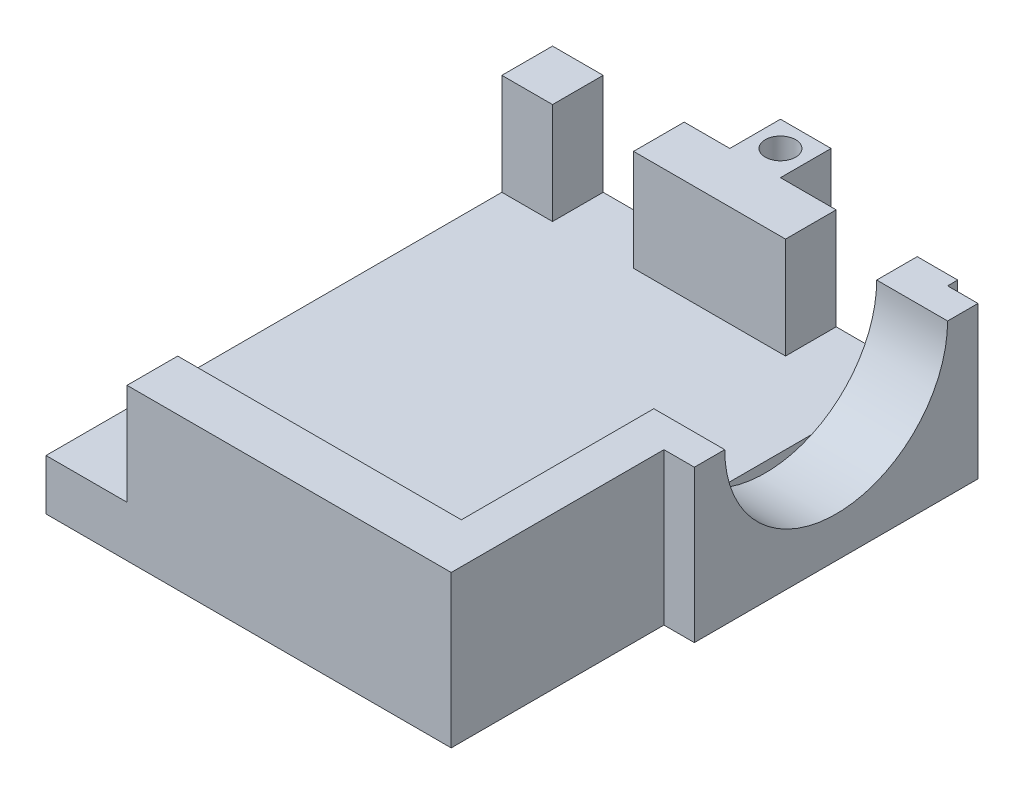
ISO-10303-21;
HEADER;
FILE_DESCRIPTION(('STEP AP214'),'2;1');
FILE_NAME('part.step','',(''),(''),'','','');
FILE_SCHEMA(('AUTOMOTIVE_DESIGN { 1 0 10303 214 1 1 1 1 }'));
ENDSEC;
DATA;
#1=APPLICATION_CONTEXT('core data for automotive mechanical design processes');
#2=APPLICATION_PROTOCOL_DEFINITION('international standard','automotive_design',2000,#1);
#3=PRODUCT_CONTEXT('',#1,'mechanical');
#4=PRODUCT('Part','Part','',(#3));
#5=PRODUCT_RELATED_PRODUCT_CATEGORY('part','',(#4));
#6=PRODUCT_DEFINITION_FORMATION('','',#4);
#7=PRODUCT_DEFINITION_CONTEXT('part definition',#1,'design');
#8=PRODUCT_DEFINITION('design','',#6,#7);
#9=PRODUCT_DEFINITION_SHAPE('','',#8);
#10=(LENGTH_UNIT() NAMED_UNIT(*) SI_UNIT(.MILLI.,.METRE.));
#11=(NAMED_UNIT(*) PLANE_ANGLE_UNIT() SI_UNIT($,.RADIAN.));
#12=(NAMED_UNIT(*) SI_UNIT($,.STERADIAN.) SOLID_ANGLE_UNIT());
#13=UNCERTAINTY_MEASURE_WITH_UNIT(LENGTH_MEASURE(1.E-05),#10,'distance_accuracy_value','');
#14=(GEOMETRIC_REPRESENTATION_CONTEXT(3) GLOBAL_UNCERTAINTY_ASSIGNED_CONTEXT((#13)) GLOBAL_UNIT_ASSIGNED_CONTEXT((#10,
#11,#12)) REPRESENTATION_CONTEXT('',''));
#15=CARTESIAN_POINT('',(0.,0.,0.));
#16=DIRECTION('',(0.,0.,1.));
#17=DIRECTION('',(1.,0.,0.));
#18=AXIS2_PLACEMENT_3D('',#15,#16,#17);
#19=CARTESIAN_POINT('',(-20.,5.,-25.));
#20=DIRECTION('',(0.,0.,1.));
#21=DIRECTION('',(1.,0.,0.));
#22=AXIS2_PLACEMENT_3D('',#19,#20,#21);
#23=PLANE('',#22);
#24=DIRECTION('',(0.,1.,0.));
#25=VECTOR('',#24,1.);
#26=CARTESIAN_POINT('',(-2.5,10.,-25.));
#27=LINE('',#26,#25);
#28=CARTESIAN_POINT('',(-2.5,10.,-25.));
#29=VERTEX_POINT('',#28);
#30=CARTESIAN_POINT('',(-2.5,15.,-25.));
#31=VERTEX_POINT('',#30);
#32=EDGE_CURVE('E116',#29,#31,#27,.T.);
#33=ORIENTED_EDGE('',*,*,#32,.F.);
#34=DIRECTION('',(-1.,0.,0.));
#35=VECTOR('',#34,1.);
#36=CARTESIAN_POINT('',(-2.5,10.,-25.));
#37=LINE('',#36,#35);
#38=CARTESIAN_POINT('',(2.5,10.,-25.));
#39=VERTEX_POINT('',#38);
#40=EDGE_CURVE('E293',#39,#29,#37,.T.);
#41=ORIENTED_EDGE('',*,*,#40,.F.);
#42=DIRECTION('',(0.,-1.,0.));
#43=VECTOR('',#42,1.);
#44=CARTESIAN_POINT('',(2.5,10.,-25.));
#45=LINE('',#44,#43);
#46=CARTESIAN_POINT('',(2.5,15.,-25.));
#47=VERTEX_POINT('',#46);
#48=EDGE_CURVE('E835',#47,#39,#45,.T.);
#49=ORIENTED_EDGE('',*,*,#48,.F.);
#50=DIRECTION('',(-1.,0.,0.));
#51=VECTOR('',#50,1.);
#52=CARTESIAN_POINT('',(0.,15.,-25.));
#53=LINE('',#52,#51);
#54=CARTESIAN_POINT('',(8.,15.,-25.));
#55=VERTEX_POINT('',#54);
#56=EDGE_CURVE('E406',#55,#47,#53,.T.);
#57=ORIENTED_EDGE('',*,*,#56,.F.);
#58=DIRECTION('',(0.,-1.,0.));
#59=VECTOR('',#58,1.);
#60=CARTESIAN_POINT('',(8.,15.,-25.));
#61=LINE('',#60,#59);
#62=CARTESIAN_POINT('',(8.,5.,-25.));
#63=VERTEX_POINT('',#62);
#64=EDGE_CURVE('E360',#55,#63,#61,.T.);
#65=ORIENTED_EDGE('',*,*,#64,.T.);
#66=DIRECTION('',(-1.,0.,0.));
#67=VECTOR('',#66,1.);
#68=CARTESIAN_POINT('',(-20.,5.,-25.));
#69=LINE('',#68,#67);
#70=CARTESIAN_POINT('',(16.,5.,-25.));
#71=VERTEX_POINT('',#70);
#72=EDGE_CURVE('E440',#71,#63,#69,.T.);
#73=ORIENTED_EDGE('',*,*,#72,.F.);
#74=DIRECTION('',(0.,-1.,0.));
#75=VECTOR('',#74,1.);
#76=CARTESIAN_POINT('',(16.,15.,-25.));
#77=LINE('',#76,#75);
#78=CARTESIAN_POINT('',(16.,15.,-25.));
#79=VERTEX_POINT('',#78);
#80=EDGE_CURVE('E346',#79,#71,#77,.T.);
#81=ORIENTED_EDGE('',*,*,#80,.F.);
#82=DIRECTION('',(-1.,0.,0.));
#83=VECTOR('',#82,1.);
#84=CARTESIAN_POINT('',(0.,15.,-25.));
#85=LINE('',#84,#83);
#86=CARTESIAN_POINT('',(20.,15.,-25.));
#87=VERTEX_POINT('',#86);
#88=EDGE_CURVE('E377',#87,#79,#85,.T.);
#89=ORIENTED_EDGE('',*,*,#88,.F.);
#90=DIRECTION('',(0.,-1.,0.));
#91=VECTOR('',#90,1.);
#92=CARTESIAN_POINT('',(20.,5.,-25.));
#93=LINE('',#92,#91);
#94=CARTESIAN_POINT('',(20.,0.,-25.));
#95=VERTEX_POINT('',#94);
#96=EDGE_CURVE('E453',#87,#95,#93,.T.);
#97=ORIENTED_EDGE('',*,*,#96,.T.);
#98=DIRECTION('',(-1.,0.,0.));
#99=VECTOR('',#98,1.);
#100=CARTESIAN_POINT('',(-20.,0.,-25.));
#101=LINE('',#100,#99);
#102=CARTESIAN_POINT('',(-20.,0.,-25.));
#103=VERTEX_POINT('',#102);
#104=EDGE_CURVE('E436',#95,#103,#101,.T.);
#105=ORIENTED_EDGE('',*,*,#104,.T.);
#106=DIRECTION('',(0.,-1.,0.));
#107=VECTOR('',#106,1.);
#108=CARTESIAN_POINT('',(-20.,5.,-25.));
#109=LINE('',#108,#107);
#110=CARTESIAN_POINT('',(-20.,15.,-25.));
#111=VERTEX_POINT('',#110);
#112=EDGE_CURVE('E442',#111,#103,#109,.T.);
#113=ORIENTED_EDGE('',*,*,#112,.F.);
#114=DIRECTION('',(1.,0.,0.));
#115=VECTOR('',#114,1.);
#116=CARTESIAN_POINT('',(-20.,15.,-25.));
#117=LINE('',#116,#115);
#118=CARTESIAN_POINT('',(-15.,15.,-25.));
#119=VERTEX_POINT('',#118);
#120=EDGE_CURVE('E416',#111,#119,#117,.T.);
#121=ORIENTED_EDGE('',*,*,#120,.T.);
#122=DIRECTION('',(0.,-1.,0.));
#123=VECTOR('',#122,1.);
#124=CARTESIAN_POINT('',(-15.,15.,-25.));
#125=LINE('',#124,#123);
#126=CARTESIAN_POINT('',(-15.,5.,-25.));
#127=VERTEX_POINT('',#126);
#128=EDGE_CURVE('E426',#119,#127,#125,.T.);
#129=ORIENTED_EDGE('',*,*,#128,.T.);
#130=CARTESIAN_POINT('',(-7.,5.,-25.));
#131=VERTEX_POINT('',#130);
#132=EDGE_CURVE('E439',#131,#127,#69,.T.);
#133=ORIENTED_EDGE('',*,*,#132,.F.);
#134=DIRECTION('',(0.,-1.,0.));
#135=VECTOR('',#134,1.);
#136=CARTESIAN_POINT('',(-7.,15.,-25.));
#137=LINE('',#136,#135);
#138=CARTESIAN_POINT('',(-7.,15.,-25.));
#139=VERTEX_POINT('',#138);
#140=EDGE_CURVE('E385',#139,#131,#137,.T.);
#141=ORIENTED_EDGE('',*,*,#140,.F.);
#142=EDGE_CURVE('E121',#31,#139,#53,.T.);
#143=ORIENTED_EDGE('',*,*,#142,.F.);
#144=EDGE_LOOP('',(#33,#41,#49,#57,#65,#73,#81,#89,#97,#105,#113,#121,#129,#133,#141,#143));
#145=FACE_BOUND('',#144,.T.);
#146=ADVANCED_FACE('F101',(#145),#23,.F.);
#147=CARTESIAN_POINT('',(20.,5.,-25.));
#148=DIRECTION('',(-1.,0.,0.));
#149=DIRECTION('',(0.,0.,1.));
#150=AXIS2_PLACEMENT_3D('',#147,#148,#149);
#151=PLANE('',#150);
#152=DIRECTION('',(0.,-1.,0.));
#153=VECTOR('',#152,1.);
#154=CARTESIAN_POINT('',(20.,15.,4.00000000000002));
#155=LINE('',#154,#153);
#156=CARTESIAN_POINT('',(20.,15.,4.00000000000002));
#157=VERTEX_POINT('',#156);
#158=CARTESIAN_POINT('',(20.,0.,4.00000000000002));
#159=VERTEX_POINT('',#158);
#160=EDGE_CURVE('E299',#157,#159,#155,.T.);
#161=ORIENTED_EDGE('',*,*,#160,.F.);
#162=DIRECTION('',(0.,0.,-1.));
#163=VECTOR('',#162,1.);
#164=CARTESIAN_POINT('',(20.,15.,0.));
#165=LINE('',#164,#163);
#166=CARTESIAN_POINT('',(20.,15.,25.));
#167=VERTEX_POINT('',#166);
#168=EDGE_CURVE('E380',#167,#157,#165,.T.);
#169=ORIENTED_EDGE('',*,*,#168,.F.);
#170=DIRECTION('',(0.,-1.,0.));
#171=VECTOR('',#170,1.);
#172=CARTESIAN_POINT('',(20.,5.,25.));
#173=LINE('',#172,#171);
#174=CARTESIAN_POINT('',(20.,0.,25.));
#175=VERTEX_POINT('',#174);
#176=EDGE_CURVE('E109',#167,#175,#173,.T.);
#177=ORIENTED_EDGE('',*,*,#176,.T.);
#178=DIRECTION('',(0.,0.,-1.));
#179=VECTOR('',#178,1.);
#180=CARTESIAN_POINT('',(20.,0.,-25.));
#181=LINE('',#180,#179);
#182=EDGE_CURVE('E448',#175,#159,#181,.T.);
#183=ORIENTED_EDGE('',*,*,#182,.T.);
#184=EDGE_LOOP('',(#161,#169,#177,#183));
#185=FACE_BOUND('',#184,.T.);
#186=ADVANCED_FACE('F459',(#185),#151,.F.);
#187=DIRECTION('',(0.,1.,0.));
#188=VECTOR('',#187,1.);
#189=CARTESIAN_POINT('',(20.,0.,-24.));
#190=LINE('',#189,#188);
#191=CARTESIAN_POINT('',(20.,0.,-24.));
#192=VERTEX_POINT('',#191);
#193=CARTESIAN_POINT('',(20.,15.,-24.));
#194=VERTEX_POINT('',#193);
#195=EDGE_CURVE('E296',#192,#194,#190,.T.);
#196=ORIENTED_EDGE('',*,*,#195,.F.);
#197=EDGE_CURVE('E447',#192,#95,#181,.T.);
#198=ORIENTED_EDGE('',*,*,#197,.T.);
#199=ORIENTED_EDGE('',*,*,#96,.F.);
#200=EDGE_CURVE('E379',#194,#87,#165,.T.);
#201=ORIENTED_EDGE('',*,*,#200,.F.);
#202=EDGE_LOOP('',(#196,#198,#199,#201));
#203=FACE_BOUND('',#202,.T.);
#204=ADVANCED_FACE('F500',(#203),#151,.F.);
#205=CARTESIAN_POINT('',(16.,15.,0.));
#206=DIRECTION('',(1.,0.,0.));
#207=DIRECTION('',(0.,0.,-1.));
#208=AXIS2_PLACEMENT_3D('',#205,#206,#207);
#209=PLANE('',#208);
#210=DIRECTION('',(0.,0.,1.));
#211=VECTOR('',#210,1.);
#212=CARTESIAN_POINT('',(16.,15.,0.));
#213=LINE('',#212,#211);
#214=CARTESIAN_POINT('',(16.,15.,1.00000000000002));
#215=VERTEX_POINT('',#214);
#216=CARTESIAN_POINT('',(16.,15.,20.));
#217=VERTEX_POINT('',#216);
#218=EDGE_CURVE('E370',#215,#217,#213,.T.);
#219=ORIENTED_EDGE('',*,*,#218,.F.);
#220=CARTESIAN_POINT('',(16.,15.,-9.99999999999998));
#221=DIRECTION('',(1.,0.,0.));
#222=DIRECTION('',(0.,0.,-1.));
#223=AXIS2_PLACEMENT_3D('',#220,#221,#222);
#224=CIRCLE('',#223,11.);
#225=CARTESIAN_POINT('',(16.,5.,-5.41742430504414));
#226=VERTEX_POINT('',#225);
#227=EDGE_CURVE('E335',#215,#226,#224,.T.);
#228=ORIENTED_EDGE('',*,*,#227,.T.);
#229=DIRECTION('',(0.,0.,1.));
#230=VECTOR('',#229,1.);
#231=CARTESIAN_POINT('',(16.,5.,0.));
#232=LINE('',#231,#230);
#233=CARTESIAN_POINT('',(16.,5.,20.));
#234=VERTEX_POINT('',#233);
#235=EDGE_CURVE('E373',#226,#234,#232,.T.);
#236=ORIENTED_EDGE('',*,*,#235,.T.);
#237=DIRECTION('',(0.,-1.,0.));
#238=VECTOR('',#237,1.);
#239=CARTESIAN_POINT('',(16.,15.,20.));
#240=LINE('',#239,#238);
#241=EDGE_CURVE('E367',#217,#234,#240,.T.);
#242=ORIENTED_EDGE('',*,*,#241,.F.);
#243=EDGE_LOOP('',(#219,#228,#236,#242));
#244=FACE_BOUND('',#243,.T.);
#245=ADVANCED_FACE('F518',(#244),#209,.F.);
#246=CARTESIAN_POINT('',(0.,15.,0.));
#247=DIRECTION('',(0.,1.,0.));
#248=DIRECTION('',(0.,0.,1.));
#249=AXIS2_PLACEMENT_3D('',#246,#247,#248);
#250=PLANE('',#249);
#251=DIRECTION('',(1.,0.,0.));
#252=VECTOR('',#251,1.);
#253=CARTESIAN_POINT('',(16.,15.,1.00000000000002));
#254=LINE('',#253,#252);
#255=CARTESIAN_POINT('',(23.,15.,1.00000000000003));
#256=VERTEX_POINT('',#255);
#257=EDGE_CURVE('E340',#215,#256,#254,.T.);
#258=ORIENTED_EDGE('',*,*,#257,.F.);
#259=ORIENTED_EDGE('',*,*,#218,.T.);
#260=DIRECTION('',(-1.,0.,0.));
#261=VECTOR('',#260,1.);
#262=CARTESIAN_POINT('',(-6.99999999999999,15.,20.));
#263=LINE('',#262,#261);
#264=CARTESIAN_POINT('',(-12.,15.,20.));
#265=VERTEX_POINT('',#264);
#266=EDGE_CURVE('E349',#217,#265,#263,.T.);
#267=ORIENTED_EDGE('',*,*,#266,.T.);
#268=DIRECTION('',(0.,0.,1.));
#269=VECTOR('',#268,1.);
#270=CARTESIAN_POINT('',(-12.,15.,20.));
#271=LINE('',#270,#269);
#272=CARTESIAN_POINT('',(-12.,15.,25.));
#273=VERTEX_POINT('',#272);
#274=EDGE_CURVE('E362',#265,#273,#271,.T.);
#275=ORIENTED_EDGE('',*,*,#274,.T.);
#276=DIRECTION('',(-1.,0.,0.));
#277=VECTOR('',#276,1.);
#278=CARTESIAN_POINT('',(-6.99999999999999,15.,25.));
#279=LINE('',#278,#277);
#280=EDGE_CURVE('E357',#167,#273,#279,.T.);
#281=ORIENTED_EDGE('',*,*,#280,.F.);
#282=ORIENTED_EDGE('',*,*,#168,.T.);
#283=DIRECTION('',(-1.,0.,0.));
#284=VECTOR('',#283,1.);
#285=CARTESIAN_POINT('',(23.,15.,4.00000000000002));
#286=LINE('',#285,#284);
#287=CARTESIAN_POINT('',(23.,15.,4.00000000000002));
#288=VERTEX_POINT('',#287);
#289=EDGE_CURVE('E325',#288,#157,#286,.T.);
#290=ORIENTED_EDGE('',*,*,#289,.F.);
#291=DIRECTION('',(0.,0.,1.));
#292=VECTOR('',#291,1.);
#293=CARTESIAN_POINT('',(23.,15.,1.00000000000003));
#294=LINE('',#293,#292);
#295=EDGE_CURVE('E316',#256,#288,#294,.T.);
#296=ORIENTED_EDGE('',*,*,#295,.F.);
#297=EDGE_LOOP('',(#258,#259,#267,#275,#281,#282,#290,#296));
#298=FACE_BOUND('',#297,.T.);
#299=ADVANCED_FACE('F474',(#298),#250,.T.);
#300=CARTESIAN_POINT('',(0.,5.,0.));
#301=DIRECTION('',(0.,1.,0.));
#302=DIRECTION('',(0.,0.,1.));
#303=AXIS2_PLACEMENT_3D('',#300,#301,#302);
#304=PLANE('',#303);
#305=DIRECTION('',(-1.,0.,0.));
#306=VECTOR('',#305,1.);
#307=CARTESIAN_POINT('',(-6.99999999999999,5.,20.));
#308=LINE('',#307,#306);
#309=CARTESIAN_POINT('',(-12.,5.,20.));
#310=VERTEX_POINT('',#309);
#311=EDGE_CURVE('E353',#234,#310,#308,.T.);
#312=ORIENTED_EDGE('',*,*,#311,.F.);
#313=ORIENTED_EDGE('',*,*,#235,.F.);
#314=DIRECTION('',(0.,0.,-1.));
#315=VECTOR('',#314,1.);
#316=CARTESIAN_POINT('',(16.,5.,0.));
#317=LINE('',#316,#315);
#318=CARTESIAN_POINT('',(16.,5.,-14.5825756949558));
#319=VERTEX_POINT('',#318);
#320=EDGE_CURVE('E342',#226,#319,#317,.T.);
#321=ORIENTED_EDGE('',*,*,#320,.T.);
#322=EDGE_CURVE('E352',#71,#319,#232,.T.);
#323=ORIENTED_EDGE('',*,*,#322,.F.);
#324=ORIENTED_EDGE('',*,*,#72,.T.);
#325=DIRECTION('',(0.,0.,1.));
#326=VECTOR('',#325,1.);
#327=CARTESIAN_POINT('',(8.,5.,0.));
#328=LINE('',#327,#326);
#329=CARTESIAN_POINT('',(8.,5.,-20.));
#330=VERTEX_POINT('',#329);
#331=EDGE_CURVE('E399',#63,#330,#328,.T.);
#332=ORIENTED_EDGE('',*,*,#331,.T.);
#333=DIRECTION('',(1.,0.,0.));
#334=VECTOR('',#333,1.);
#335=CARTESIAN_POINT('',(0.,5.,-20.));
#336=LINE('',#335,#334);
#337=CARTESIAN_POINT('',(-7.,5.,-20.));
#338=VERTEX_POINT('',#337);
#339=EDGE_CURVE('E392',#338,#330,#336,.T.);
#340=ORIENTED_EDGE('',*,*,#339,.F.);
#341=DIRECTION('',(0.,0.,1.));
#342=VECTOR('',#341,1.);
#343=CARTESIAN_POINT('',(-6.99999999999999,5.,0.));
#344=LINE('',#343,#342);
#345=EDGE_CURVE('E395',#131,#338,#344,.T.);
#346=ORIENTED_EDGE('',*,*,#345,.F.);
#347=ORIENTED_EDGE('',*,*,#132,.T.);
#348=DIRECTION('',(0.,0.,1.));
#349=VECTOR('',#348,1.);
#350=CARTESIAN_POINT('',(-15.,5.,-25.));
#351=LINE('',#350,#349);
#352=CARTESIAN_POINT('',(-15.,5.,-20.));
#353=VERTEX_POINT('',#352);
#354=EDGE_CURVE('E413',#127,#353,#351,.T.);
#355=ORIENTED_EDGE('',*,*,#354,.T.);
#356=DIRECTION('',(1.,0.,0.));
#357=VECTOR('',#356,1.);
#358=CARTESIAN_POINT('',(-20.,5.,-20.));
#359=LINE('',#358,#357);
#360=CARTESIAN_POINT('',(-20.,5.,-20.));
#361=VERTEX_POINT('',#360);
#362=EDGE_CURVE('E402',#361,#353,#359,.T.);
#363=ORIENTED_EDGE('',*,*,#362,.F.);
#364=DIRECTION('',(0.,0.,1.));
#365=VECTOR('',#364,1.);
#366=CARTESIAN_POINT('',(-20.,5.,-25.));
#367=LINE('',#366,#365);
#368=CARTESIAN_POINT('',(-20.,5.,25.));
#369=VERTEX_POINT('',#368);
#370=EDGE_CURVE('E433',#361,#369,#367,.T.);
#371=ORIENTED_EDGE('',*,*,#370,.T.);
#372=DIRECTION('',(1.,0.,0.));
#373=VECTOR('',#372,1.);
#374=CARTESIAN_POINT('',(-20.,5.,25.));
#375=LINE('',#374,#373);
#376=CARTESIAN_POINT('',(-12.,5.,25.));
#377=VERTEX_POINT('',#376);
#378=EDGE_CURVE('E435',#369,#377,#375,.T.);
#379=ORIENTED_EDGE('',*,*,#378,.T.);
#380=DIRECTION('',(0.,0.,1.));
#381=VECTOR('',#380,1.);
#382=CARTESIAN_POINT('',(-12.,5.,20.));
#383=LINE('',#382,#381);
#384=EDGE_CURVE('E356',#310,#377,#383,.T.);
#385=ORIENTED_EDGE('',*,*,#384,.F.);
#386=EDGE_LOOP('',(#312,#313,#321,#323,#324,#332,#340,#346,#347,#355,#363,#371,#379,#385));
#387=FACE_BOUND('',#386,.T.);
#388=ADVANCED_FACE('F487',(#387),#304,.T.);
#389=CARTESIAN_POINT('',(-20.,5.,-25.));
#390=DIRECTION('',(1.,0.,0.));
#391=DIRECTION('',(0.,0.,-1.));
#392=AXIS2_PLACEMENT_3D('',#389,#390,#391);
#393=PLANE('',#392);
#394=DIRECTION('',(0.,0.,1.));
#395=VECTOR('',#394,1.);
#396=CARTESIAN_POINT('',(-20.,0.,-25.));
#397=LINE('',#396,#395);
#398=CARTESIAN_POINT('',(-20.,0.,25.));
#399=VERTEX_POINT('',#398);
#400=EDGE_CURVE('E432',#103,#399,#397,.T.);
#401=ORIENTED_EDGE('',*,*,#400,.T.);
#402=DIRECTION('',(0.,-1.,0.));
#403=VECTOR('',#402,1.);
#404=CARTESIAN_POINT('',(-20.,5.,25.));
#405=LINE('',#404,#403);
#406=EDGE_CURVE('E12',#369,#399,#405,.T.);
#407=ORIENTED_EDGE('',*,*,#406,.F.);
#408=ORIENTED_EDGE('',*,*,#370,.F.);
#409=DIRECTION('',(0.,-1.,0.));
#410=VECTOR('',#409,1.);
#411=CARTESIAN_POINT('',(-20.,15.,-20.));
#412=LINE('',#411,#410);
#413=CARTESIAN_POINT('',(-20.,15.,-20.));
#414=VERTEX_POINT('',#413);
#415=EDGE_CURVE('E421',#414,#361,#412,.T.);
#416=ORIENTED_EDGE('',*,*,#415,.F.);
#417=DIRECTION('',(0.,0.,1.));
#418=VECTOR('',#417,1.);
#419=CARTESIAN_POINT('',(-20.,15.,-25.));
#420=LINE('',#419,#418);
#421=EDGE_CURVE('E419',#111,#414,#420,.T.);
#422=ORIENTED_EDGE('',*,*,#421,.F.);
#423=ORIENTED_EDGE('',*,*,#112,.T.);
#424=EDGE_LOOP('',(#401,#407,#408,#416,#422,#423));
#425=FACE_BOUND('',#424,.T.);
#426=ADVANCED_FACE('F103',(#425),#393,.F.);
#427=CARTESIAN_POINT('',(-20.,5.,25.));
#428=DIRECTION('',(0.,0.,-1.));
#429=DIRECTION('',(-1.,0.,0.));
#430=AXIS2_PLACEMENT_3D('',#427,#428,#429);
#431=PLANE('',#430);
#432=DIRECTION('',(1.,0.,0.));
#433=VECTOR('',#432,1.);
#434=CARTESIAN_POINT('',(-20.,0.,25.));
#435=LINE('',#434,#433);
#436=EDGE_CURVE('E445',#399,#175,#435,.T.);
#437=ORIENTED_EDGE('',*,*,#436,.T.);
#438=ORIENTED_EDGE('',*,*,#176,.F.);
#439=ORIENTED_EDGE('',*,*,#280,.T.);
#440=DIRECTION('',(0.,-1.,0.));
#441=VECTOR('',#440,1.);
#442=CARTESIAN_POINT('',(-12.,15.,25.));
#443=LINE('',#442,#441);
#444=EDGE_CURVE('E347',#273,#377,#443,.T.);
#445=ORIENTED_EDGE('',*,*,#444,.T.);
#446=ORIENTED_EDGE('',*,*,#378,.F.);
#447=ORIENTED_EDGE('',*,*,#406,.T.);
#448=EDGE_LOOP('',(#437,#438,#439,#445,#446,#447));
#449=FACE_BOUND('',#448,.T.);
#450=ADVANCED_FACE('F478',(#449),#431,.F.);
#451=CARTESIAN_POINT('',(0.,0.,0.));
#452=DIRECTION('',(0.,1.,0.));
#453=DIRECTION('',(0.,0.,1.));
#454=AXIS2_PLACEMENT_3D('',#451,#452,#453);
#455=PLANE('',#454);
#456=ORIENTED_EDGE('',*,*,#400,.F.);
#457=ORIENTED_EDGE('',*,*,#104,.F.);
#458=ORIENTED_EDGE('',*,*,#197,.F.);
#459=DIRECTION('',(-1.,0.,0.));
#460=VECTOR('',#459,1.);
#461=CARTESIAN_POINT('',(23.,0.,-24.));
#462=LINE('',#461,#460);
#463=CARTESIAN_POINT('',(23.,0.,-24.));
#464=VERTEX_POINT('',#463);
#465=EDGE_CURVE('E331',#464,#192,#462,.T.);
#466=ORIENTED_EDGE('',*,*,#465,.F.);
#467=DIRECTION('',(0.,0.,-1.));
#468=VECTOR('',#467,1.);
#469=CARTESIAN_POINT('',(23.,0.,4.00000000000002));
#470=LINE('',#469,#468);
#471=CARTESIAN_POINT('',(23.,0.,4.00000000000002));
#472=VERTEX_POINT('',#471);
#473=EDGE_CURVE('E305',#472,#464,#470,.T.);
#474=ORIENTED_EDGE('',*,*,#473,.F.);
#475=DIRECTION('',(-1.,0.,0.));
#476=VECTOR('',#475,1.);
#477=CARTESIAN_POINT('',(23.,0.,4.00000000000002));
#478=LINE('',#477,#476);
#479=EDGE_CURVE('E319',#472,#159,#478,.T.);
#480=ORIENTED_EDGE('',*,*,#479,.T.);
#481=ORIENTED_EDGE('',*,*,#182,.F.);
#482=ORIENTED_EDGE('',*,*,#436,.F.);
#483=EDGE_LOOP('',(#456,#457,#458,#466,#474,#480,#481,#482));
#484=FACE_BOUND('',#483,.T.);
#485=ADVANCED_FACE('F464',(#484),#455,.F.);
#486=CARTESIAN_POINT('',(-20.,15.,-20.));
#487=DIRECTION('',(0.,0.,-1.));
#488=DIRECTION('',(-1.,0.,0.));
#489=AXIS2_PLACEMENT_3D('',#486,#487,#488);
#490=PLANE('',#489);
#491=ORIENTED_EDGE('',*,*,#362,.T.);
#492=DIRECTION('',(0.,-1.,0.));
#493=VECTOR('',#492,1.);
#494=CARTESIAN_POINT('',(-15.,15.,-20.));
#495=LINE('',#494,#493);
#496=CARTESIAN_POINT('',(-15.,15.,-20.));
#497=VERTEX_POINT('',#496);
#498=EDGE_CURVE('E429',#497,#353,#495,.T.);
#499=ORIENTED_EDGE('',*,*,#498,.F.);
#500=DIRECTION('',(1.,0.,0.));
#501=VECTOR('',#500,1.);
#502=CARTESIAN_POINT('',(-20.,15.,-20.));
#503=LINE('',#502,#501);
#504=EDGE_CURVE('E410',#414,#497,#503,.T.);
#505=ORIENTED_EDGE('',*,*,#504,.F.);
#506=ORIENTED_EDGE('',*,*,#415,.T.);
#507=EDGE_LOOP('',(#491,#499,#505,#506));
#508=FACE_BOUND('',#507,.T.);
#509=ADVANCED_FACE('F551',(#508),#490,.F.);
#510=CARTESIAN_POINT('',(-15.,15.,-25.));
#511=DIRECTION('',(1.,0.,0.));
#512=DIRECTION('',(0.,0.,-1.));
#513=AXIS2_PLACEMENT_3D('',#510,#511,#512);
#514=PLANE('',#513);
#515=ORIENTED_EDGE('',*,*,#354,.F.);
#516=ORIENTED_EDGE('',*,*,#128,.F.);
#517=DIRECTION('',(0.,0.,1.));
#518=VECTOR('',#517,1.);
#519=CARTESIAN_POINT('',(-15.,15.,-25.));
#520=LINE('',#519,#518);
#521=EDGE_CURVE('E412',#119,#497,#520,.T.);
#522=ORIENTED_EDGE('',*,*,#521,.T.);
#523=ORIENTED_EDGE('',*,*,#498,.T.);
#524=EDGE_LOOP('',(#515,#516,#522,#523));
#525=FACE_BOUND('',#524,.T.);
#526=ADVANCED_FACE('F548',(#525),#514,.T.);
#527=CARTESIAN_POINT('',(0.,15.,0.));
#528=DIRECTION('',(0.,-1.,0.));
#529=DIRECTION('',(0.,0.,-1.));
#530=AXIS2_PLACEMENT_3D('',#527,#528,#529);
#531=PLANE('',#530);
#532=ORIENTED_EDGE('',*,*,#504,.T.);
#533=ORIENTED_EDGE('',*,*,#521,.F.);
#534=ORIENTED_EDGE('',*,*,#120,.F.);
#535=ORIENTED_EDGE('',*,*,#421,.T.);
#536=EDGE_LOOP('',(#532,#533,#534,#535));
#537=FACE_BOUND('',#536,.T.);
#538=ADVANCED_FACE('F553',(#537),#531,.F.);
#539=CARTESIAN_POINT('',(8.,15.,0.));
#540=DIRECTION('',(1.,0.,0.));
#541=DIRECTION('',(0.,0.,-1.));
#542=AXIS2_PLACEMENT_3D('',#539,#540,#541);
#543=PLANE('',#542);
#544=ORIENTED_EDGE('',*,*,#331,.F.);
#545=ORIENTED_EDGE('',*,*,#64,.F.);
#546=DIRECTION('',(0.,0.,1.));
#547=VECTOR('',#546,1.);
#548=CARTESIAN_POINT('',(8.,15.,0.));
#549=LINE('',#548,#547);
#550=CARTESIAN_POINT('',(8.,15.,-20.));
#551=VERTEX_POINT('',#550);
#552=EDGE_CURVE('E396',#55,#551,#549,.T.);
#553=ORIENTED_EDGE('',*,*,#552,.T.);
#554=DIRECTION('',(0.,-1.,0.));
#555=VECTOR('',#554,1.);
#556=CARTESIAN_POINT('',(8.,15.,-20.));
#557=LINE('',#556,#555);
#558=EDGE_CURVE('E389',#551,#330,#557,.T.);
#559=ORIENTED_EDGE('',*,*,#558,.T.);
#560=EDGE_LOOP('',(#544,#545,#553,#559));
#561=FACE_BOUND('',#560,.T.);
#562=ADVANCED_FACE('F534',(#561),#543,.T.);
#563=CARTESIAN_POINT('',(-6.99999999999999,15.,0.));
#564=DIRECTION('',(1.,0.,0.));
#565=DIRECTION('',(0.,0.,-1.));
#566=AXIS2_PLACEMENT_3D('',#563,#564,#565);
#567=PLANE('',#566);
#568=ORIENTED_EDGE('',*,*,#345,.T.);
#569=DIRECTION('',(0.,-1.,0.));
#570=VECTOR('',#569,1.);
#571=CARTESIAN_POINT('',(-7.,15.,-20.));
#572=LINE('',#571,#570);
#573=CARTESIAN_POINT('',(-7.,15.,-20.));
#574=VERTEX_POINT('',#573);
#575=EDGE_CURVE('E387',#574,#338,#572,.T.);
#576=ORIENTED_EDGE('',*,*,#575,.F.);
#577=DIRECTION('',(0.,0.,1.));
#578=VECTOR('',#577,1.);
#579=CARTESIAN_POINT('',(-6.99999999999999,15.,0.));
#580=LINE('',#579,#578);
#581=EDGE_CURVE('E404',#139,#574,#580,.T.);
#582=ORIENTED_EDGE('',*,*,#581,.F.);
#583=ORIENTED_EDGE('',*,*,#140,.T.);
#584=EDGE_LOOP('',(#568,#576,#582,#583));
#585=FACE_BOUND('',#584,.T.);
#586=ADVANCED_FACE('F542',(#585),#567,.F.);
#587=CARTESIAN_POINT('',(0.,15.,-20.));
#588=DIRECTION('',(0.,0.,-1.));
#589=DIRECTION('',(-1.,0.,0.));
#590=AXIS2_PLACEMENT_3D('',#587,#588,#589);
#591=PLANE('',#590);
#592=ORIENTED_EDGE('',*,*,#339,.T.);
#593=ORIENTED_EDGE('',*,*,#558,.F.);
#594=DIRECTION('',(1.,0.,0.));
#595=VECTOR('',#594,1.);
#596=CARTESIAN_POINT('',(0.,15.,-20.));
#597=LINE('',#596,#595);
#598=EDGE_CURVE('E391',#574,#551,#597,.T.);
#599=ORIENTED_EDGE('',*,*,#598,.F.);
#600=ORIENTED_EDGE('',*,*,#575,.T.);
#601=EDGE_LOOP('',(#592,#593,#599,#600));
#602=FACE_BOUND('',#601,.T.);
#603=ADVANCED_FACE('F538',(#602),#591,.F.);
#604=CARTESIAN_POINT('',(0.,15.,0.));
#605=DIRECTION('',(0.,1.,0.));
#606=DIRECTION('',(0.,0.,1.));
#607=AXIS2_PLACEMENT_3D('',#604,#605,#606);
#608=PLANE('',#607);
#609=CARTESIAN_POINT('',(0.,15.,-27.5));
#610=DIRECTION('',(0.,-1.,0.));
#611=DIRECTION('',(0.,0.,-1.));
#612=AXIS2_PLACEMENT_3D('',#609,#610,#611);
#613=CIRCLE('',#612,1.5);
#614=CARTESIAN_POINT('',(0.,15.,-29.));
#615=VERTEX_POINT('',#614);
#616=EDGE_CURVE('E824',#615,#615,#613,.T.);
#617=ORIENTED_EDGE('',*,*,#616,.T.);
#618=EDGE_LOOP('',(#617));
#619=FACE_BOUND('',#618,.T.);
#620=ORIENTED_EDGE('',*,*,#552,.F.);
#621=ORIENTED_EDGE('',*,*,#56,.T.);
#622=DIRECTION('',(0.,0.,1.));
#623=VECTOR('',#622,1.);
#624=CARTESIAN_POINT('',(2.5,15.,-30.));
#625=LINE('',#624,#623);
#626=CARTESIAN_POINT('',(2.5,15.,-30.));
#627=VERTEX_POINT('',#626);
#628=EDGE_CURVE('E280',#627,#47,#625,.T.);
#629=ORIENTED_EDGE('',*,*,#628,.F.);
#630=DIRECTION('',(1.,0.,0.));
#631=VECTOR('',#630,1.);
#632=CARTESIAN_POINT('',(-2.5,15.,-30.));
#633=LINE('',#632,#631);
#634=CARTESIAN_POINT('',(-2.5,15.,-30.));
#635=VERTEX_POINT('',#634);
#636=EDGE_CURVE('E272',#635,#627,#633,.T.);
#637=ORIENTED_EDGE('',*,*,#636,.F.);
#638=DIRECTION('',(0.,0.,1.));
#639=VECTOR('',#638,1.);
#640=CARTESIAN_POINT('',(-2.5,15.,-30.));
#641=LINE('',#640,#639);
#642=EDGE_CURVE('E277',#635,#31,#641,.T.);
#643=ORIENTED_EDGE('',*,*,#642,.T.);
#644=ORIENTED_EDGE('',*,*,#142,.T.);
#645=ORIENTED_EDGE('',*,*,#581,.T.);
#646=ORIENTED_EDGE('',*,*,#598,.T.);
#647=EDGE_LOOP('',(#620,#621,#629,#637,#643,#644,#645,#646));
#648=FACE_BOUND('',#647,.T.);
#649=ADVANCED_FACE('F275',(#619,#648),#608,.T.);
#650=ORIENTED_EDGE('',*,*,#322,.T.);
#651=CARTESIAN_POINT('',(16.,15.,-21.));
#652=VERTEX_POINT('',#651);
#653=EDGE_CURVE('E334',#319,#652,#224,.T.);
#654=ORIENTED_EDGE('',*,*,#653,.T.);
#655=EDGE_CURVE('E374',#79,#652,#213,.T.);
#656=ORIENTED_EDGE('',*,*,#655,.F.);
#657=ORIENTED_EDGE('',*,*,#80,.T.);
#658=EDGE_LOOP('',(#650,#654,#656,#657));
#659=FACE_BOUND('',#658,.T.);
#660=ADVANCED_FACE('F527',(#659),#209,.F.);
#661=CARTESIAN_POINT('',(0.,15.,20.));
#662=DIRECTION('',(0.,0.,1.));
#663=DIRECTION('',(1.,0.,0.));
#664=AXIS2_PLACEMENT_3D('',#661,#662,#663);
#665=PLANE('',#664);
#666=ORIENTED_EDGE('',*,*,#241,.T.);
#667=ORIENTED_EDGE('',*,*,#311,.T.);
#668=DIRECTION('',(0.,-1.,0.));
#669=VECTOR('',#668,1.);
#670=CARTESIAN_POINT('',(-12.,15.,20.));
#671=LINE('',#670,#669);
#672=EDGE_CURVE('E350',#265,#310,#671,.T.);
#673=ORIENTED_EDGE('',*,*,#672,.F.);
#674=ORIENTED_EDGE('',*,*,#266,.F.);
#675=EDGE_LOOP('',(#666,#667,#673,#674));
#676=FACE_BOUND('',#675,.T.);
#677=ADVANCED_FACE('F521',(#676),#665,.F.);
#678=DIRECTION('',(1.,0.,0.));
#679=VECTOR('',#678,1.);
#680=CARTESIAN_POINT('',(16.,15.,-21.));
#681=LINE('',#680,#679);
#682=CARTESIAN_POINT('',(23.,15.,-21.));
#683=VERTEX_POINT('',#682);
#684=EDGE_CURVE('E338',#652,#683,#681,.T.);
#685=ORIENTED_EDGE('',*,*,#684,.T.);
#686=DIRECTION('',(0.,0.,1.));
#687=VECTOR('',#686,1.);
#688=CARTESIAN_POINT('',(23.,15.,-24.));
#689=LINE('',#688,#687);
#690=CARTESIAN_POINT('',(23.,15.,-24.));
#691=VERTEX_POINT('',#690);
#692=EDGE_CURVE('E310',#691,#683,#689,.T.);
#693=ORIENTED_EDGE('',*,*,#692,.F.);
#694=DIRECTION('',(-1.,0.,0.));
#695=VECTOR('',#694,1.);
#696=CARTESIAN_POINT('',(23.,15.,-24.));
#697=LINE('',#696,#695);
#698=EDGE_CURVE('E328',#691,#194,#697,.T.);
#699=ORIENTED_EDGE('',*,*,#698,.T.);
#700=ORIENTED_EDGE('',*,*,#200,.T.);
#701=ORIENTED_EDGE('',*,*,#88,.T.);
#702=ORIENTED_EDGE('',*,*,#655,.T.);
#703=EDGE_LOOP('',(#685,#693,#699,#700,#701,#702));
#704=FACE_BOUND('',#703,.T.);
#705=ADVANCED_FACE('F506',(#704),#250,.T.);
#706=CARTESIAN_POINT('',(-12.,15.,20.));
#707=DIRECTION('',(1.,0.,0.));
#708=DIRECTION('',(0.,0.,-1.));
#709=AXIS2_PLACEMENT_3D('',#706,#707,#708);
#710=PLANE('',#709);
#711=ORIENTED_EDGE('',*,*,#384,.T.);
#712=ORIENTED_EDGE('',*,*,#444,.F.);
#713=ORIENTED_EDGE('',*,*,#274,.F.);
#714=ORIENTED_EDGE('',*,*,#672,.T.);
#715=EDGE_LOOP('',(#711,#712,#713,#714));
#716=FACE_BOUND('',#715,.T.);
#717=ADVANCED_FACE('F483',(#716),#710,.F.);
#718=CARTESIAN_POINT('',(16.,15.,-9.99999999999998));
#719=DIRECTION('',(1.,0.,0.));
#720=DIRECTION('',(0.,0.,-1.));
#721=AXIS2_PLACEMENT_3D('',#718,#719,#720);
#722=CYLINDRICAL_SURFACE('',#721,11.);
#723=ORIENTED_EDGE('',*,*,#257,.T.);
#724=CARTESIAN_POINT('',(23.,15.,-9.99999999999998));
#725=DIRECTION('',(-1.,0.,0.));
#726=DIRECTION('',(0.,0.,-1.));
#727=AXIS2_PLACEMENT_3D('',#724,#725,#726);
#728=CIRCLE('',#727,11.);
#729=EDGE_CURVE('E313',#683,#256,#728,.T.);
#730=ORIENTED_EDGE('',*,*,#729,.F.);
#731=ORIENTED_EDGE('',*,*,#684,.F.);
#732=ORIENTED_EDGE('',*,*,#653,.F.);
#733=EDGE_CURVE('E339',#226,#319,#224,.T.);
#734=ORIENTED_EDGE('',*,*,#733,.F.);
#735=ORIENTED_EDGE('',*,*,#227,.F.);
#736=EDGE_LOOP('',(#723,#730,#731,#732,#734,#735));
#737=FACE_BOUND('',#736,.T.);
#738=ADVANCED_FACE('F511',(#737),#722,.F.);
#739=CARTESIAN_POINT('',(16.,15.,-9.99999999999998));
#740=DIRECTION('',(1.,0.,0.));
#741=DIRECTION('',(0.,0.,-1.));
#742=AXIS2_PLACEMENT_3D('',#739,#740,#741);
#743=PLANE('',#742);
#744=ORIENTED_EDGE('',*,*,#733,.T.);
#745=ORIENTED_EDGE('',*,*,#320,.F.);
#746=EDGE_LOOP('',(#744,#745));
#747=FACE_BOUND('',#746,.T.);
#748=ADVANCED_FACE('F679',(#747),#743,.T.);
#749=CARTESIAN_POINT('',(23.,0.,-24.));
#750=DIRECTION('',(0.,0.,1.));
#751=DIRECTION('',(1.,0.,0.));
#752=AXIS2_PLACEMENT_3D('',#749,#750,#751);
#753=PLANE('',#752);
#754=ORIENTED_EDGE('',*,*,#195,.T.);
#755=ORIENTED_EDGE('',*,*,#698,.F.);
#756=DIRECTION('',(0.,1.,0.));
#757=VECTOR('',#756,1.);
#758=CARTESIAN_POINT('',(23.,0.,-24.));
#759=LINE('',#758,#757);
#760=EDGE_CURVE('E308',#464,#691,#759,.T.);
#761=ORIENTED_EDGE('',*,*,#760,.F.);
#762=ORIENTED_EDGE('',*,*,#465,.T.);
#763=EDGE_LOOP('',(#754,#755,#761,#762));
#764=FACE_BOUND('',#763,.T.);
#765=ADVANCED_FACE('F503',(#764),#753,.F.);
#766=CARTESIAN_POINT('',(23.,15.,4.00000000000002));
#767=DIRECTION('',(0.,0.,-1.));
#768=DIRECTION('',(0.,1.,0.));
#769=AXIS2_PLACEMENT_3D('',#766,#767,#768);
#770=PLANE('',#769);
#771=ORIENTED_EDGE('',*,*,#160,.T.);
#772=ORIENTED_EDGE('',*,*,#479,.F.);
#773=DIRECTION('',(0.,-1.,0.));
#774=VECTOR('',#773,1.);
#775=CARTESIAN_POINT('',(23.,15.,4.00000000000002));
#776=LINE('',#775,#774);
#777=EDGE_CURVE('E318',#288,#472,#776,.T.);
#778=ORIENTED_EDGE('',*,*,#777,.F.);
#779=ORIENTED_EDGE('',*,*,#289,.T.);
#780=EDGE_LOOP('',(#771,#772,#778,#779));
#781=FACE_BOUND('',#780,.T.);
#782=ADVANCED_FACE('F470',(#781),#770,.F.);
#783=CARTESIAN_POINT('',(23.,15.,-9.99999999999998));
#784=DIRECTION('',(1.,0.,0.));
#785=DIRECTION('',(0.,0.,-1.));
#786=AXIS2_PLACEMENT_3D('',#783,#784,#785);
#787=PLANE('',#786);
#788=ORIENTED_EDGE('',*,*,#473,.T.);
#789=ORIENTED_EDGE('',*,*,#760,.T.);
#790=ORIENTED_EDGE('',*,*,#692,.T.);
#791=ORIENTED_EDGE('',*,*,#729,.T.);
#792=ORIENTED_EDGE('',*,*,#295,.T.);
#793=ORIENTED_EDGE('',*,*,#777,.T.);
#794=EDGE_LOOP('',(#788,#789,#790,#791,#792,#793));
#795=FACE_BOUND('',#794,.T.);
#796=ADVANCED_FACE('F509',(#795),#787,.T.);
#797=CARTESIAN_POINT('',(-2.5,10.,-30.));
#798=DIRECTION('',(1.,0.,0.));
#799=DIRECTION('',(0.,1.,0.));
#800=AXIS2_PLACEMENT_3D('',#797,#798,#799);
#801=PLANE('',#800);
#802=ORIENTED_EDGE('',*,*,#32,.T.);
#803=ORIENTED_EDGE('',*,*,#642,.F.);
#804=DIRECTION('',(0.,1.,0.));
#805=VECTOR('',#804,1.);
#806=CARTESIAN_POINT('',(-2.5,10.,-30.));
#807=LINE('',#806,#805);
#808=CARTESIAN_POINT('',(-2.5,10.,-30.));
#809=VERTEX_POINT('',#808);
#810=EDGE_CURVE('E284',#809,#635,#807,.T.);
#811=ORIENTED_EDGE('',*,*,#810,.F.);
#812=DIRECTION('',(0.,0.,1.));
#813=VECTOR('',#812,1.);
#814=CARTESIAN_POINT('',(-2.5,10.,-30.));
#815=LINE('',#814,#813);
#816=EDGE_CURVE('E833',#809,#29,#815,.T.);
#817=ORIENTED_EDGE('',*,*,#816,.T.);
#818=EDGE_LOOP('',(#802,#803,#811,#817));
#819=FACE_BOUND('',#818,.T.);
#820=ADVANCED_FACE('F295',(#819),#801,.F.);
#821=CARTESIAN_POINT('',(2.5,10.,-30.));
#822=DIRECTION('',(-1.,0.,0.));
#823=DIRECTION('',(0.,0.,1.));
#824=AXIS2_PLACEMENT_3D('',#821,#822,#823);
#825=PLANE('',#824);
#826=ORIENTED_EDGE('',*,*,#48,.T.);
#827=DIRECTION('',(0.,0.,1.));
#828=VECTOR('',#827,1.);
#829=CARTESIAN_POINT('',(2.5,10.,-30.));
#830=LINE('',#829,#828);
#831=CARTESIAN_POINT('',(2.5,10.,-30.));
#832=VERTEX_POINT('',#831);
#833=EDGE_CURVE('E301',#832,#39,#830,.T.);
#834=ORIENTED_EDGE('',*,*,#833,.F.);
#835=DIRECTION('',(0.,-1.,0.));
#836=VECTOR('',#835,1.);
#837=CARTESIAN_POINT('',(2.5,10.,-30.));
#838=LINE('',#837,#836);
#839=EDGE_CURVE('E283',#627,#832,#838,.T.);
#840=ORIENTED_EDGE('',*,*,#839,.F.);
#841=ORIENTED_EDGE('',*,*,#628,.T.);
#842=EDGE_LOOP('',(#826,#834,#840,#841));
#843=FACE_BOUND('',#842,.T.);
#844=ADVANCED_FACE('F764',(#843),#825,.F.);
#845=CARTESIAN_POINT('',(-2.5,10.,-30.));
#846=DIRECTION('',(0.,1.,0.));
#847=DIRECTION('',(0.,0.,1.));
#848=AXIS2_PLACEMENT_3D('',#845,#846,#847);
#849=PLANE('',#848);
#850=CARTESIAN_POINT('',(0.,10.,-27.5));
#851=DIRECTION('',(0.,-1.,0.));
#852=DIRECTION('',(0.,0.,-1.));
#853=AXIS2_PLACEMENT_3D('',#850,#851,#852);
#854=CIRCLE('',#853,1.5);
#855=CARTESIAN_POINT('',(0.,10.,-29.));
#856=VERTEX_POINT('',#855);
#857=EDGE_CURVE('E827',#856,#856,#854,.T.);
#858=ORIENTED_EDGE('',*,*,#857,.F.);
#859=EDGE_LOOP('',(#858));
#860=FACE_BOUND('',#859,.T.);
#861=ORIENTED_EDGE('',*,*,#40,.T.);
#862=ORIENTED_EDGE('',*,*,#816,.F.);
#863=DIRECTION('',(-1.,0.,0.));
#864=VECTOR('',#863,1.);
#865=CARTESIAN_POINT('',(-2.5,10.,-30.));
#866=LINE('',#865,#864);
#867=EDGE_CURVE('E289',#832,#809,#866,.T.);
#868=ORIENTED_EDGE('',*,*,#867,.F.);
#869=ORIENTED_EDGE('',*,*,#833,.T.);
#870=EDGE_LOOP('',(#861,#862,#868,#869));
#871=FACE_BOUND('',#870,.T.);
#872=ADVANCED_FACE('F774',(#860,#871),#849,.F.);
#873=CARTESIAN_POINT('',(0.,0.,-30.));
#874=DIRECTION('',(0.,0.,-1.));
#875=DIRECTION('',(-1.,0.,0.));
#876=AXIS2_PLACEMENT_3D('',#873,#874,#875);
#877=PLANE('',#876);
#878=ORIENTED_EDGE('',*,*,#810,.T.);
#879=ORIENTED_EDGE('',*,*,#636,.T.);
#880=ORIENTED_EDGE('',*,*,#839,.T.);
#881=ORIENTED_EDGE('',*,*,#867,.T.);
#882=EDGE_LOOP('',(#878,#879,#880,#881));
#883=FACE_BOUND('',#882,.T.);
#884=ADVANCED_FACE('F287',(#883),#877,.T.);
#885=CARTESIAN_POINT('',(0.,15.,-27.5));
#886=DIRECTION('',(0.,-1.,0.));
#887=DIRECTION('',(0.,0.,-1.));
#888=AXIS2_PLACEMENT_3D('',#885,#886,#887);
#889=CYLINDRICAL_SURFACE('',#888,1.5);
#890=ORIENTED_EDGE('',*,*,#616,.F.);
#891=EDGE_LOOP('',(#890));
#892=FACE_BOUND('',#891,.T.);
#893=ORIENTED_EDGE('',*,*,#857,.T.);
#894=EDGE_LOOP('',(#893));
#895=FACE_BOUND('',#894,.T.);
#896=ADVANCED_FACE('F787',(#892,#895),#889,.F.);
#897=CLOSED_SHELL('',(#146,#186,#204,#245,#299,#388,#426,#450,#485,#509,#526,#538,#562,#586,
#603,#649,#660,#677,#705,#717,#738,#748,#765,#782,#796,#820,#844,#872,#884,#896));
#898=MANIFOLD_SOLID_BREP('B2',#897);
#899=ADVANCED_BREP_SHAPE_REPRESENTATION('',(#18,#898),#14);
#900=SHAPE_DEFINITION_REPRESENTATION(#9,#899);
ENDSEC;
END-ISO-10303-21;
